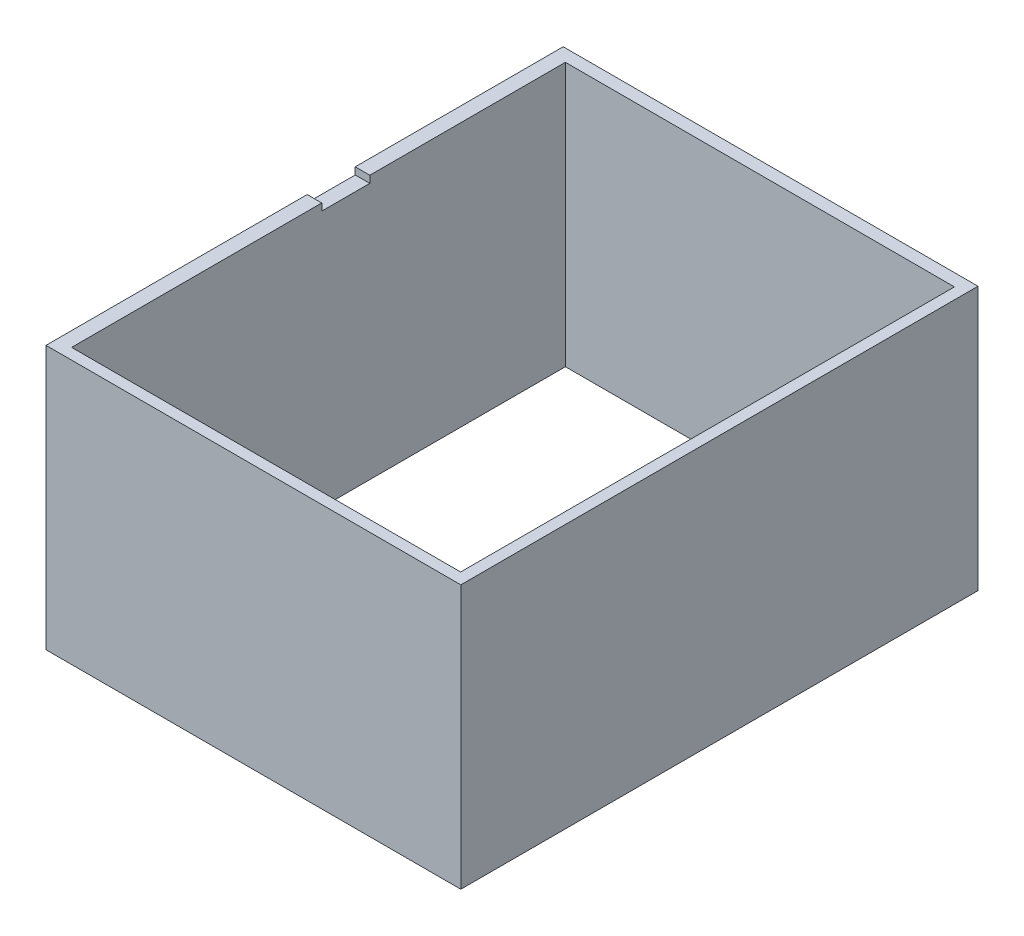
ISO-10303-21;
HEADER;
FILE_DESCRIPTION(('STEP AP214'),'2;1');
FILE_NAME('part.step','',(''),(''),'','','');
FILE_SCHEMA(('AUTOMOTIVE_DESIGN { 1 0 10303 214 1 1 1 1 }'));
ENDSEC;
DATA;
#1=APPLICATION_CONTEXT('core data for automotive mechanical design processes');
#2=APPLICATION_PROTOCOL_DEFINITION('international standard','automotive_design',2000,#1);
#3=PRODUCT_CONTEXT('',#1,'mechanical');
#4=PRODUCT('Part','Part','',(#3));
#5=PRODUCT_RELATED_PRODUCT_CATEGORY('part','',(#4));
#6=PRODUCT_DEFINITION_FORMATION('','',#4);
#7=PRODUCT_DEFINITION_CONTEXT('part definition',#1,'design');
#8=PRODUCT_DEFINITION('design','',#6,#7);
#9=PRODUCT_DEFINITION_SHAPE('','',#8);
#10=(LENGTH_UNIT() NAMED_UNIT(*) SI_UNIT(.MILLI.,.METRE.));
#11=(NAMED_UNIT(*) PLANE_ANGLE_UNIT() SI_UNIT($,.RADIAN.));
#12=(NAMED_UNIT(*) SI_UNIT($,.STERADIAN.) SOLID_ANGLE_UNIT());
#13=UNCERTAINTY_MEASURE_WITH_UNIT(LENGTH_MEASURE(1.E-05),#10,'distance_accuracy_value','');
#14=(GEOMETRIC_REPRESENTATION_CONTEXT(3) GLOBAL_UNCERTAINTY_ASSIGNED_CONTEXT((#13)) GLOBAL_UNIT_ASSIGNED_CONTEXT((#10,
#11,#12)) REPRESENTATION_CONTEXT('',''));
#15=CARTESIAN_POINT('',(0.,0.,0.));
#16=DIRECTION('',(0.,0.,1.));
#17=DIRECTION('',(1.,0.,0.));
#18=AXIS2_PLACEMENT_3D('',#15,#16,#17);
#19=CARTESIAN_POINT('',(5672.94753646897,3737.,156.519621551999));
#20=DIRECTION('',(0.,-1.,0.));
#21=DIRECTION('',(0.,0.,-1.));
#22=AXIS2_PLACEMENT_3D('',#19,#20,#21);
#23=PLANE('',#22);
#24=DIRECTION('',(0.,0.,1.));
#25=VECTOR('',#24,1.);
#26=CARTESIAN_POINT('',(-206.545150671694,3737.,-7174.3959465146));
#27=LINE('',#26,#25);
#28=CARTESIAN_POINT('',(-206.545150671694,3737.,-7174.3959465146));
#29=VERTEX_POINT('',#28);
#30=CARTESIAN_POINT('',(-206.545150671694,3737.,-4226.22400934753));
#31=VERTEX_POINT('',#30);
#32=EDGE_CURVE('E144',#29,#31,#27,.T.);
#33=ORIENTED_EDGE('',*,*,#32,.T.);
#34=DIRECTION('',(-1.,0.,0.));
#35=VECTOR('',#34,1.);
#36=CARTESIAN_POINT('',(-665.919315130962,3737.,-4226.22400934753));
#37=LINE('',#36,#35);
#38=CARTESIAN_POINT('',(-2.22044604925031E-13,3737.,-4226.22400934753));
#39=VERTEX_POINT('',#38);
#40=EDGE_CURVE('E138',#39,#31,#37,.T.);
#41=ORIENTED_EDGE('',*,*,#40,.F.);
#42=DIRECTION('',(0.,0.,1.));
#43=VECTOR('',#42,1.);
#44=CARTESIAN_POINT('',(0.,3737.,0.));
#45=LINE('',#44,#43);
#46=CARTESIAN_POINT('',(0.,3737.,-6999.));
#47=VERTEX_POINT('',#46);
#48=EDGE_CURVE('E194',#47,#39,#45,.T.);
#49=ORIENTED_EDGE('',*,*,#48,.F.);
#50=DIRECTION('',(-1.,0.,0.));
#51=VECTOR('',#50,1.);
#52=CARTESIAN_POINT('',(0.,3737.,-6999.));
#53=LINE('',#52,#51);
#54=CARTESIAN_POINT('',(5514.,3737.,-6999.));
#55=VERTEX_POINT('',#54);
#56=EDGE_CURVE('E200',#55,#47,#53,.T.);
#57=ORIENTED_EDGE('',*,*,#56,.F.);
#58=DIRECTION('',(0.,0.,-1.));
#59=VECTOR('',#58,1.);
#60=CARTESIAN_POINT('',(5514.,3737.,0.));
#61=LINE('',#60,#59);
#62=CARTESIAN_POINT('',(5514.,3737.,0.));
#63=VERTEX_POINT('',#62);
#64=EDGE_CURVE('E198',#63,#55,#61,.T.);
#65=ORIENTED_EDGE('',*,*,#64,.F.);
#66=DIRECTION('',(1.,0.,0.));
#67=VECTOR('',#66,1.);
#68=CARTESIAN_POINT('',(0.,3737.,0.));
#69=LINE('',#68,#67);
#70=CARTESIAN_POINT('',(0.,3737.,0.));
#71=VERTEX_POINT('',#70);
#72=EDGE_CURVE('E196',#71,#63,#69,.T.);
#73=ORIENTED_EDGE('',*,*,#72,.F.);
#74=CARTESIAN_POINT('',(-2.22044604925031E-13,3737.,-3545.91165974246));
#75=VERTEX_POINT('',#74);
#76=EDGE_CURVE('E137',#75,#71,#45,.T.);
#77=ORIENTED_EDGE('',*,*,#76,.F.);
#78=DIRECTION('',(1.,0.,0.));
#79=VECTOR('',#78,1.);
#80=CARTESIAN_POINT('',(-665.919315130962,3737.,-3545.91165974246));
#81=LINE('',#80,#79);
#82=CARTESIAN_POINT('',(-206.545150671694,3737.,-3545.91165974246));
#83=VERTEX_POINT('',#82);
#84=EDGE_CURVE('E123',#83,#75,#81,.T.);
#85=ORIENTED_EDGE('',*,*,#84,.F.);
#86=CARTESIAN_POINT('',(-206.545150671694,3737.,156.519621551999));
#87=VERTEX_POINT('',#86);
#88=EDGE_CURVE('E134',#83,#87,#27,.T.);
#89=ORIENTED_EDGE('',*,*,#88,.T.);
#90=DIRECTION('',(1.,0.,0.));
#91=VECTOR('',#90,1.);
#92=CARTESIAN_POINT('',(5672.94753646897,3737.,156.519621551999));
#93=LINE('',#92,#91);
#94=CARTESIAN_POINT('',(5672.94753646897,3737.,156.519621551999));
#95=VERTEX_POINT('',#94);
#96=EDGE_CURVE('E147',#87,#95,#93,.T.);
#97=ORIENTED_EDGE('',*,*,#96,.T.);
#98=DIRECTION('',(0.,0.,-1.));
#99=VECTOR('',#98,1.);
#100=CARTESIAN_POINT('',(5672.94753646897,3737.,-7174.3959465146));
#101=LINE('',#100,#99);
#102=CARTESIAN_POINT('',(5672.94753646897,3737.,-7174.3959465146));
#103=VERTEX_POINT('',#102);
#104=EDGE_CURVE('E148',#95,#103,#101,.T.);
#105=ORIENTED_EDGE('',*,*,#104,.T.);
#106=DIRECTION('',(-1.,0.,0.));
#107=VECTOR('',#106,1.);
#108=CARTESIAN_POINT('',(5672.94753646897,3737.,-7174.3959465146));
#109=LINE('',#108,#107);
#110=EDGE_CURVE('E145',#103,#29,#109,.T.);
#111=ORIENTED_EDGE('',*,*,#110,.T.);
#112=EDGE_LOOP('',(#33,#41,#49,#57,#65,#73,#77,#85,#89,#97,#105,#111));
#113=FACE_BOUND('',#112,.T.);
#114=ADVANCED_FACE('F33',(#113),#23,.F.);
#115=CARTESIAN_POINT('',(5672.94753646897,0.,156.519621551999));
#116=DIRECTION('',(0.,-1.,0.));
#117=DIRECTION('',(0.,0.,-1.));
#118=AXIS2_PLACEMENT_3D('',#115,#116,#117);
#119=PLANE('',#118);
#120=DIRECTION('',(0.,0.,-1.));
#121=VECTOR('',#120,1.);
#122=CARTESIAN_POINT('',(5672.94753646897,0.,-7174.3959465146));
#123=LINE('',#122,#121);
#124=CARTESIAN_POINT('',(5672.94753646897,0.,156.519621551999));
#125=VERTEX_POINT('',#124);
#126=CARTESIAN_POINT('',(5672.94753646897,0.,-7174.3959465146));
#127=VERTEX_POINT('',#126);
#128=EDGE_CURVE('E154',#125,#127,#123,.T.);
#129=ORIENTED_EDGE('',*,*,#128,.F.);
#130=DIRECTION('',(1.,0.,0.));
#131=VECTOR('',#130,1.);
#132=CARTESIAN_POINT('',(5672.94753646897,0.,156.519621551999));
#133=LINE('',#132,#131);
#134=CARTESIAN_POINT('',(-206.545150671694,0.,156.519621551999));
#135=VERTEX_POINT('',#134);
#136=EDGE_CURVE('E162',#135,#125,#133,.T.);
#137=ORIENTED_EDGE('',*,*,#136,.F.);
#138=DIRECTION('',(0.,0.,1.));
#139=VECTOR('',#138,1.);
#140=CARTESIAN_POINT('',(-206.545150671694,0.,-7174.3959465146));
#141=LINE('',#140,#139);
#142=CARTESIAN_POINT('',(-206.545150671694,0.,-7174.3959465146));
#143=VERTEX_POINT('',#142);
#144=EDGE_CURVE('E160',#143,#135,#141,.T.);
#145=ORIENTED_EDGE('',*,*,#144,.F.);
#146=DIRECTION('',(-1.,0.,0.));
#147=VECTOR('',#146,1.);
#148=CARTESIAN_POINT('',(5672.94753646897,0.,-7174.3959465146));
#149=LINE('',#148,#147);
#150=EDGE_CURVE('E157',#127,#143,#149,.T.);
#151=ORIENTED_EDGE('',*,*,#150,.F.);
#152=EDGE_LOOP('',(#129,#137,#145,#151));
#153=FACE_BOUND('',#152,.T.);
#154=DIRECTION('',(-1.,0.,0.));
#155=VECTOR('',#154,1.);
#156=CARTESIAN_POINT('',(0.,0.,-6999.));
#157=LINE('',#156,#155);
#158=CARTESIAN_POINT('',(5514.,0.,-6999.));
#159=VERTEX_POINT('',#158);
#160=CARTESIAN_POINT('',(0.,0.,-6999.));
#161=VERTEX_POINT('',#160);
#162=EDGE_CURVE('E211',#159,#161,#157,.T.);
#163=ORIENTED_EDGE('',*,*,#162,.T.);
#164=DIRECTION('',(0.,0.,1.));
#165=VECTOR('',#164,1.);
#166=CARTESIAN_POINT('',(0.,0.,0.));
#167=LINE('',#166,#165);
#168=CARTESIAN_POINT('',(0.,0.,0.));
#169=VERTEX_POINT('',#168);
#170=EDGE_CURVE('E193',#161,#169,#167,.T.);
#171=ORIENTED_EDGE('',*,*,#170,.T.);
#172=DIRECTION('',(1.,0.,0.));
#173=VECTOR('',#172,1.);
#174=CARTESIAN_POINT('',(0.,0.,0.));
#175=LINE('',#174,#173);
#176=CARTESIAN_POINT('',(5514.,0.,0.));
#177=VERTEX_POINT('',#176);
#178=EDGE_CURVE('E205',#169,#177,#175,.T.);
#179=ORIENTED_EDGE('',*,*,#178,.T.);
#180=DIRECTION('',(0.,0.,-1.));
#181=VECTOR('',#180,1.);
#182=CARTESIAN_POINT('',(5514.,0.,0.));
#183=LINE('',#182,#181);
#184=EDGE_CURVE('E208',#177,#159,#183,.T.);
#185=ORIENTED_EDGE('',*,*,#184,.T.);
#186=EDGE_LOOP('',(#163,#171,#179,#185));
#187=FACE_BOUND('',#186,.T.);
#188=ADVANCED_FACE('F236',(#153,#187),#119,.T.);
#189=CARTESIAN_POINT('',(5672.94753646897,3737.,-7174.3959465146));
#190=DIRECTION('',(-1.,0.,0.));
#191=DIRECTION('',(0.,0.,1.));
#192=AXIS2_PLACEMENT_3D('',#189,#190,#191);
#193=PLANE('',#192);
#194=ORIENTED_EDGE('',*,*,#128,.T.);
#195=DIRECTION('',(0.,-1.,0.));
#196=VECTOR('',#195,1.);
#197=CARTESIAN_POINT('',(5672.94753646897,3737.,-7174.3959465146));
#198=LINE('',#197,#196);
#199=EDGE_CURVE('E170',#103,#127,#198,.T.);
#200=ORIENTED_EDGE('',*,*,#199,.F.);
#201=ORIENTED_EDGE('',*,*,#104,.F.);
#202=DIRECTION('',(0.,-1.,0.));
#203=VECTOR('',#202,1.);
#204=CARTESIAN_POINT('',(5672.94753646897,3737.,156.519621551999));
#205=LINE('',#204,#203);
#206=EDGE_CURVE('E153',#95,#125,#205,.T.);
#207=ORIENTED_EDGE('',*,*,#206,.T.);
#208=EDGE_LOOP('',(#194,#200,#201,#207));
#209=FACE_BOUND('',#208,.T.);
#210=ADVANCED_FACE('F35',(#209),#193,.F.);
#211=CARTESIAN_POINT('',(5672.94753646897,3737.,-7174.3959465146));
#212=DIRECTION('',(0.,0.,1.));
#213=DIRECTION('',(1.,0.,0.));
#214=AXIS2_PLACEMENT_3D('',#211,#212,#213);
#215=PLANE('',#214);
#216=ORIENTED_EDGE('',*,*,#150,.T.);
#217=DIRECTION('',(0.,-1.,0.));
#218=VECTOR('',#217,1.);
#219=CARTESIAN_POINT('',(-206.545150671694,3737.,-7174.3959465146));
#220=LINE('',#219,#218);
#221=EDGE_CURVE('E167',#29,#143,#220,.T.);
#222=ORIENTED_EDGE('',*,*,#221,.F.);
#223=ORIENTED_EDGE('',*,*,#110,.F.);
#224=ORIENTED_EDGE('',*,*,#199,.T.);
#225=EDGE_LOOP('',(#216,#222,#223,#224));
#226=FACE_BOUND('',#225,.T.);
#227=ADVANCED_FACE('F228',(#226),#215,.F.);
#228=CARTESIAN_POINT('',(-206.545150671694,3737.,-7174.3959465146));
#229=DIRECTION('',(1.,0.,0.));
#230=DIRECTION('',(0.,0.,-1.));
#231=AXIS2_PLACEMENT_3D('',#228,#229,#230);
#232=PLANE('',#231);
#233=DIRECTION('',(0.,0.,1.));
#234=VECTOR('',#233,1.);
#235=CARTESIAN_POINT('',(-206.545150671694,3637.,-7174.3959465146));
#236=LINE('',#235,#234);
#237=CARTESIAN_POINT('',(-206.545150671694,3637.,-4226.22400934753));
#238=VERTEX_POINT('',#237);
#239=CARTESIAN_POINT('',(-206.545150671694,3637.,-3545.91165974246));
#240=VERTEX_POINT('',#239);
#241=EDGE_CURVE('E129',#238,#240,#236,.T.);
#242=ORIENTED_EDGE('',*,*,#241,.F.);
#243=DIRECTION('',(0.,1.,0.));
#244=VECTOR('',#243,1.);
#245=CARTESIAN_POINT('',(-206.545150671694,3737.,-4226.22400934753));
#246=LINE('',#245,#244);
#247=EDGE_CURVE('E128',#238,#31,#246,.T.);
#248=ORIENTED_EDGE('',*,*,#247,.T.);
#249=ORIENTED_EDGE('',*,*,#32,.F.);
#250=ORIENTED_EDGE('',*,*,#221,.T.);
#251=ORIENTED_EDGE('',*,*,#144,.T.);
#252=DIRECTION('',(0.,-1.,0.));
#253=VECTOR('',#252,1.);
#254=CARTESIAN_POINT('',(-206.545150671694,3737.,156.519621551999));
#255=LINE('',#254,#253);
#256=EDGE_CURVE('E142',#87,#135,#255,.T.);
#257=ORIENTED_EDGE('',*,*,#256,.F.);
#258=ORIENTED_EDGE('',*,*,#88,.F.);
#259=DIRECTION('',(0.,-1.,0.));
#260=VECTOR('',#259,1.);
#261=CARTESIAN_POINT('',(-206.545150671694,3737.,-3545.91165974246));
#262=LINE('',#261,#260);
#263=EDGE_CURVE('E120',#83,#240,#262,.T.);
#264=ORIENTED_EDGE('',*,*,#263,.T.);
#265=EDGE_LOOP('',(#242,#248,#249,#250,#251,#257,#258,#264));
#266=FACE_BOUND('',#265,.T.);
#267=ADVANCED_FACE('F140',(#266),#232,.F.);
#268=CARTESIAN_POINT('',(5672.94753646897,3737.,156.519621551999));
#269=DIRECTION('',(0.,0.,-1.));
#270=DIRECTION('',(-1.,0.,0.));
#271=AXIS2_PLACEMENT_3D('',#268,#269,#270);
#272=PLANE('',#271);
#273=ORIENTED_EDGE('',*,*,#136,.T.);
#274=ORIENTED_EDGE('',*,*,#206,.F.);
#275=ORIENTED_EDGE('',*,*,#96,.F.);
#276=ORIENTED_EDGE('',*,*,#256,.T.);
#277=EDGE_LOOP('',(#273,#274,#275,#276));
#278=FACE_BOUND('',#277,.T.);
#279=ADVANCED_FACE('F252',(#278),#272,.F.);
#280=CARTESIAN_POINT('',(0.,3737.,0.));
#281=DIRECTION('',(1.,0.,0.));
#282=DIRECTION('',(0.,0.,-1.));
#283=AXIS2_PLACEMENT_3D('',#280,#281,#282);
#284=PLANE('',#283);
#285=DIRECTION('',(0.,1.,0.));
#286=VECTOR('',#285,1.);
#287=CARTESIAN_POINT('',(0.,3737.,-4226.22400934753));
#288=LINE('',#287,#286);
#289=CARTESIAN_POINT('',(-2.22044604925031E-13,3637.,-4226.22400934753));
#290=VERTEX_POINT('',#289);
#291=EDGE_CURVE('E11',#290,#39,#288,.T.);
#292=ORIENTED_EDGE('',*,*,#291,.F.);
#293=DIRECTION('',(0.,0.,1.));
#294=VECTOR('',#293,1.);
#295=CARTESIAN_POINT('',(0.,3637.,0.));
#296=LINE('',#295,#294);
#297=CARTESIAN_POINT('',(0.,3637.,-3545.91165974246));
#298=VERTEX_POINT('',#297);
#299=EDGE_CURVE('E173',#290,#298,#296,.T.);
#300=ORIENTED_EDGE('',*,*,#299,.T.);
#301=DIRECTION('',(0.,-1.,0.));
#302=VECTOR('',#301,1.);
#303=CARTESIAN_POINT('',(0.,3737.,-3545.91165974246));
#304=LINE('',#303,#302);
#305=EDGE_CURVE('E41',#75,#298,#304,.T.);
#306=ORIENTED_EDGE('',*,*,#305,.F.);
#307=ORIENTED_EDGE('',*,*,#76,.T.);
#308=DIRECTION('',(0.,-1.,0.));
#309=VECTOR('',#308,1.);
#310=CARTESIAN_POINT('',(0.,3737.,0.));
#311=LINE('',#310,#309);
#312=EDGE_CURVE('E158',#71,#169,#311,.T.);
#313=ORIENTED_EDGE('',*,*,#312,.T.);
#314=ORIENTED_EDGE('',*,*,#170,.F.);
#315=DIRECTION('',(0.,-1.,0.));
#316=VECTOR('',#315,1.);
#317=CARTESIAN_POINT('',(0.,3737.,-6999.));
#318=LINE('',#317,#316);
#319=EDGE_CURVE('E202',#47,#161,#318,.T.);
#320=ORIENTED_EDGE('',*,*,#319,.F.);
#321=ORIENTED_EDGE('',*,*,#48,.T.);
#322=EDGE_LOOP('',(#292,#300,#306,#307,#313,#314,#320,#321));
#323=FACE_BOUND('',#322,.T.);
#324=ADVANCED_FACE('F177',(#323),#284,.T.);
#325=CARTESIAN_POINT('',(0.,3737.,0.));
#326=DIRECTION('',(0.,0.,-1.));
#327=DIRECTION('',(-1.,0.,0.));
#328=AXIS2_PLACEMENT_3D('',#325,#326,#327);
#329=PLANE('',#328);
#330=ORIENTED_EDGE('',*,*,#178,.F.);
#331=ORIENTED_EDGE('',*,*,#312,.F.);
#332=ORIENTED_EDGE('',*,*,#72,.T.);
#333=DIRECTION('',(0.,-1.,0.));
#334=VECTOR('',#333,1.);
#335=CARTESIAN_POINT('',(5514.,3737.,0.));
#336=LINE('',#335,#334);
#337=EDGE_CURVE('E217',#63,#177,#336,.T.);
#338=ORIENTED_EDGE('',*,*,#337,.T.);
#339=EDGE_LOOP('',(#330,#331,#332,#338));
#340=FACE_BOUND('',#339,.T.);
#341=ADVANCED_FACE('F244',(#340),#329,.T.);
#342=CARTESIAN_POINT('',(5514.,3737.,0.));
#343=DIRECTION('',(-1.,0.,0.));
#344=DIRECTION('',(0.,0.,1.));
#345=AXIS2_PLACEMENT_3D('',#342,#343,#344);
#346=PLANE('',#345);
#347=ORIENTED_EDGE('',*,*,#184,.F.);
#348=ORIENTED_EDGE('',*,*,#337,.F.);
#349=ORIENTED_EDGE('',*,*,#64,.T.);
#350=DIRECTION('',(0.,-1.,0.));
#351=VECTOR('',#350,1.);
#352=CARTESIAN_POINT('',(5514.,3737.,-6999.));
#353=LINE('',#352,#351);
#354=EDGE_CURVE('E56',#55,#159,#353,.T.);
#355=ORIENTED_EDGE('',*,*,#354,.T.);
#356=EDGE_LOOP('',(#347,#348,#349,#355));
#357=FACE_BOUND('',#356,.T.);
#358=ADVANCED_FACE('F240',(#357),#346,.T.);
#359=CARTESIAN_POINT('',(0.,3737.,-6999.));
#360=DIRECTION('',(0.,0.,1.));
#361=DIRECTION('',(1.,0.,0.));
#362=AXIS2_PLACEMENT_3D('',#359,#360,#361);
#363=PLANE('',#362);
#364=ORIENTED_EDGE('',*,*,#162,.F.);
#365=ORIENTED_EDGE('',*,*,#354,.F.);
#366=ORIENTED_EDGE('',*,*,#56,.T.);
#367=ORIENTED_EDGE('',*,*,#319,.T.);
#368=EDGE_LOOP('',(#364,#365,#366,#367));
#369=FACE_BOUND('',#368,.T.);
#370=ADVANCED_FACE('F234',(#369),#363,.T.);
#371=CARTESIAN_POINT('',(-665.919315130962,3637.,-4226.22400934753));
#372=DIRECTION('',(0.,0.,-1.));
#373=DIRECTION('',(-1.,0.,0.));
#374=AXIS2_PLACEMENT_3D('',#371,#372,#373);
#375=PLANE('',#374);
#376=DIRECTION('',(-1.,0.,0.));
#377=VECTOR('',#376,1.);
#378=CARTESIAN_POINT('',(-665.919315130962,3637.,-4226.22400934753));
#379=LINE('',#378,#377);
#380=EDGE_CURVE('E182',#290,#238,#379,.T.);
#381=ORIENTED_EDGE('',*,*,#380,.F.);
#382=ORIENTED_EDGE('',*,*,#291,.T.);
#383=ORIENTED_EDGE('',*,*,#40,.T.);
#384=ORIENTED_EDGE('',*,*,#247,.F.);
#385=EDGE_LOOP('',(#381,#382,#383,#384));
#386=FACE_BOUND('',#385,.T.);
#387=ADVANCED_FACE('F184',(#386),#375,.F.);
#388=CARTESIAN_POINT('',(-665.919315130962,3637.,-3545.91165974246));
#389=DIRECTION('',(0.,0.,1.));
#390=DIRECTION('',(1.,0.,0.));
#391=AXIS2_PLACEMENT_3D('',#388,#389,#390);
#392=PLANE('',#391);
#393=ORIENTED_EDGE('',*,*,#84,.T.);
#394=ORIENTED_EDGE('',*,*,#305,.T.);
#395=DIRECTION('',(1.,0.,0.));
#396=VECTOR('',#395,1.);
#397=CARTESIAN_POINT('',(-665.919315130962,3637.,-3545.91165974246));
#398=LINE('',#397,#396);
#399=EDGE_CURVE('E48',#240,#298,#398,.T.);
#400=ORIENTED_EDGE('',*,*,#399,.F.);
#401=ORIENTED_EDGE('',*,*,#263,.F.);
#402=EDGE_LOOP('',(#393,#394,#400,#401));
#403=FACE_BOUND('',#402,.T.);
#404=ADVANCED_FACE('F122',(#403),#392,.F.);
#405=CARTESIAN_POINT('',(-665.919315130962,3637.,-3545.91165974246));
#406=DIRECTION('',(0.,1.,0.));
#407=DIRECTION('',(0.,0.,1.));
#408=AXIS2_PLACEMENT_3D('',#405,#406,#407);
#409=PLANE('',#408);
#410=ORIENTED_EDGE('',*,*,#241,.T.);
#411=ORIENTED_EDGE('',*,*,#399,.T.);
#412=ORIENTED_EDGE('',*,*,#299,.F.);
#413=ORIENTED_EDGE('',*,*,#380,.T.);
#414=EDGE_LOOP('',(#410,#411,#412,#413));
#415=FACE_BOUND('',#414,.T.);
#416=ADVANCED_FACE('F181',(#415),#409,.T.);
#417=CLOSED_SHELL('',(#114,#188,#210,#227,#267,#279,#324,#341,#358,#370,#387,#404,#416));
#418=MANIFOLD_SOLID_BREP('B2',#417);
#419=ADVANCED_BREP_SHAPE_REPRESENTATION('',(#18,#418),#14);
#420=SHAPE_DEFINITION_REPRESENTATION(#9,#419);
ENDSEC;
END-ISO-10303-21;
